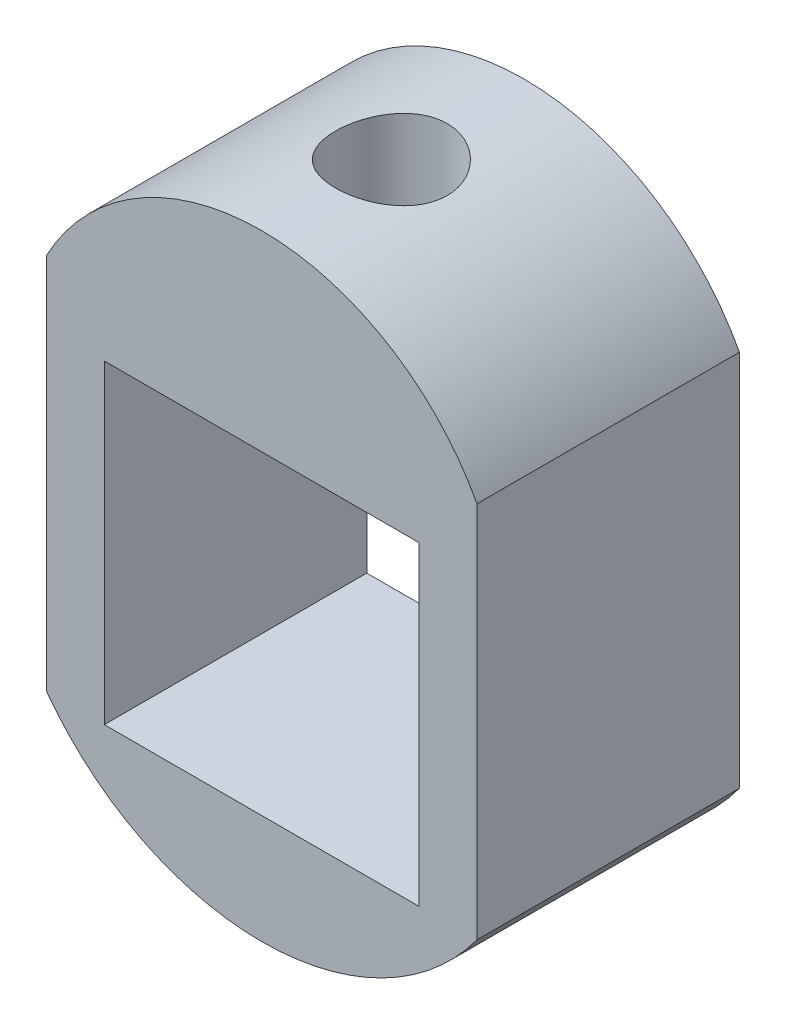
ISO-10303-21;
HEADER;
FILE_DESCRIPTION(('STEP AP214'),'2;1');
FILE_NAME('part.step','',(''),(''),'','','');
FILE_SCHEMA(('AUTOMOTIVE_DESIGN { 1 0 10303 214 1 1 1 1 }'));
ENDSEC;
DATA;
#1=APPLICATION_CONTEXT('core data for automotive mechanical design processes');
#2=APPLICATION_PROTOCOL_DEFINITION('international standard','automotive_design',2000,#1);
#3=PRODUCT_CONTEXT('',#1,'mechanical');
#4=PRODUCT('Part','Part','',(#3));
#5=PRODUCT_RELATED_PRODUCT_CATEGORY('part','',(#4));
#6=PRODUCT_DEFINITION_FORMATION('','',#4);
#7=PRODUCT_DEFINITION_CONTEXT('part definition',#1,'design');
#8=PRODUCT_DEFINITION('design','',#6,#7);
#9=PRODUCT_DEFINITION_SHAPE('','',#8);
#10=(LENGTH_UNIT() NAMED_UNIT(*) SI_UNIT(.MILLI.,.METRE.));
#11=(NAMED_UNIT(*) PLANE_ANGLE_UNIT() SI_UNIT($,.RADIAN.));
#12=(NAMED_UNIT(*) SI_UNIT($,.STERADIAN.) SOLID_ANGLE_UNIT());
#13=UNCERTAINTY_MEASURE_WITH_UNIT(LENGTH_MEASURE(1.E-05),#10,'distance_accuracy_value','');
#14=(GEOMETRIC_REPRESENTATION_CONTEXT(3) GLOBAL_UNCERTAINTY_ASSIGNED_CONTEXT((#13)) GLOBAL_UNIT_ASSIGNED_CONTEXT((#10,
#11,#12)) REPRESENTATION_CONTEXT('',''));
#15=CARTESIAN_POINT('',(0.,0.,0.));
#16=DIRECTION('',(0.,0.,1.));
#17=DIRECTION('',(1.,0.,0.));
#18=AXIS2_PLACEMENT_3D('',#15,#16,#17);
#19=CARTESIAN_POINT('',(-5.207,0.,6.35));
#20=DIRECTION('',(1.,0.,0.));
#21=DIRECTION('',(0.,0.,-1.));
#22=AXIS2_PLACEMENT_3D('',#19,#20,#21);
#23=PLANE('',#22);
#24=DIRECTION('',(0.,-1.,0.));
#25=VECTOR('',#24,1.);
#26=CARTESIAN_POINT('',(-5.207,0.,0.));
#27=LINE('',#26,#25);
#28=CARTESIAN_POINT('',(-5.207,2.78605119299707,0.));
#29=VERTEX_POINT('',#28);
#30=CARTESIAN_POINT('',(-5.207,-6.35,0.));
#31=VERTEX_POINT('',#30);
#32=EDGE_CURVE('E148',#29,#31,#27,.T.);
#33=ORIENTED_EDGE('',*,*,#32,.T.);
#34=DIRECTION('',(0.,0.,-1.));
#35=VECTOR('',#34,1.);
#36=CARTESIAN_POINT('',(-5.207,-6.35,6.35));
#37=LINE('',#36,#35);
#38=CARTESIAN_POINT('',(-5.207,-6.35,6.35));
#39=VERTEX_POINT('',#38);
#40=EDGE_CURVE('E127',#39,#31,#37,.T.);
#41=ORIENTED_EDGE('',*,*,#40,.F.);
#42=DIRECTION('',(0.,-1.,0.));
#43=VECTOR('',#42,1.);
#44=CARTESIAN_POINT('',(-5.207,0.,6.35));
#45=LINE('',#44,#43);
#46=CARTESIAN_POINT('',(-5.207,2.78605119299707,6.35));
#47=VERTEX_POINT('',#46);
#48=EDGE_CURVE('E116',#47,#39,#45,.T.);
#49=ORIENTED_EDGE('',*,*,#48,.F.);
#50=DIRECTION('',(0.,0.,-1.));
#51=VECTOR('',#50,1.);
#52=CARTESIAN_POINT('',(-5.207,2.78605119299707,6.35));
#53=LINE('',#52,#51);
#54=EDGE_CURVE('E55',#47,#29,#53,.T.);
#55=ORIENTED_EDGE('',*,*,#54,.T.);
#56=EDGE_LOOP('',(#33,#41,#49,#55));
#57=FACE_BOUND('',#56,.T.);
#58=ADVANCED_FACE('F34',(#57),#23,.F.);
#59=CARTESIAN_POINT('',(0.,-2.54,6.35));
#60=DIRECTION('',(0.,0.,-1.));
#61=DIRECTION('',(-1.,0.,0.));
#62=AXIS2_PLACEMENT_3D('',#59,#60,#61);
#63=CYLINDRICAL_SURFACE('',#62,6.45204998430731);
#64=CARTESIAN_POINT('',(1.35255,-8.84868904745669,3.175));
#65=CARTESIAN_POINT('',(1.35254731810095,-8.84869055847578,3.09992777123366));
#66=CARTESIAN_POINT('',(1.34627851866973,-8.85004364838439,3.02482255480596));
#67=CARTESIAN_POINT('',(1.32139313500362,-8.85530085935125,2.8767424233238));
#68=CARTESIAN_POINT('',(1.30276715161953,-8.85920692222398,2.80376917403624));
#69=CARTESIAN_POINT('',(1.25377504631357,-8.86910869684373,2.66211657545291));
#70=CARTESIAN_POINT('',(1.22342120677507,-8.87510222178223,2.59343282097094));
#71=CARTESIAN_POINT('',(1.15186944164405,-8.88850098616977,2.46213280625693));
#72=CARTESIAN_POINT('',(1.1106719278967,-8.89590617200065,2.39951631571237));
#73=CARTESIAN_POINT('',(1.01792048096284,-8.91142232275063,2.28115404702036));
#74=CARTESIAN_POINT('',(0.966230221653893,-8.91954168523675,2.22551618010988));
#75=CARTESIAN_POINT('',(0.854255004738417,-8.93549763141253,2.12363411274931));
#76=CARTESIAN_POINT('',(0.793969412797882,-8.94333419417808,2.07739060621264));
#77=CARTESIAN_POINT('',(0.66579569806459,-8.95793259488021,1.99518709225247));
#78=CARTESIAN_POINT('',(0.597840034780791,-8.9646833719222,1.95933026259963));
#79=CARTESIAN_POINT('',(0.456702939130856,-8.97625497327133,1.89958460707973));
#80=CARTESIAN_POINT('',(0.383522045599843,-8.98107599624044,1.87569454920836));
#81=CARTESIAN_POINT('',(0.235132843141455,-8.98818555581861,1.84089827239146));
#82=CARTESIAN_POINT('',(0.159969046284714,-8.99050964297623,1.82980961656334));
#83=CARTESIAN_POINT('',(0.00881449120110587,-8.99248644778009,1.82036110592088));
#84=CARTESIAN_POINT('',(-0.0671761789763218,-8.99213944712988,1.82199990881826));
#85=CARTESIAN_POINT('',(-0.216571729266554,-8.98884053094804,1.83782268118119));
#86=CARTESIAN_POINT('',(-0.289998462602698,-8.98592943508368,1.85181007265897));
#87=CARTESIAN_POINT('',(-0.433438831473196,-8.97787568927622,1.89162044013924));
#88=CARTESIAN_POINT('',(-0.503452321077305,-8.97273294401381,1.91744392169329));
#89=CARTESIAN_POINT('',(-0.638631957713402,-8.96072728187202,1.98037138395562));
#90=CARTESIAN_POINT('',(-0.703761778992071,-8.9538528696715,2.01755111610843));
#91=CARTESIAN_POINT('',(-0.826930238483115,-8.93913967502419,2.10207941718561));
#92=CARTESIAN_POINT('',(-0.884967983241743,-8.93130077132072,2.14942926526468));
#93=CARTESIAN_POINT('',(-0.993472738957296,-8.91534552825491,2.2540280367513));
#94=CARTESIAN_POINT('',(-1.0437736680983,-8.9072267502823,2.31144901333151));
#95=CARTESIAN_POINT('',(-1.1340611255008,-8.89176816342655,2.43399446794144));
#96=CARTESIAN_POINT('',(-1.1740474181972,-8.88442837233611,2.49911912185777));
#97=CARTESIAN_POINT('',(-1.24263607596657,-8.87135313917361,2.63547685852368));
#98=CARTESIAN_POINT('',(-1.27120929603508,-8.86562181551361,2.70672502248883));
#99=CARTESIAN_POINT('',(-1.31592882493586,-8.85647106327837,2.85315957228081));
#100=CARTESIAN_POINT('',(-1.3320769288861,-8.85305130074916,2.92834538753864));
#101=CARTESIAN_POINT('',(-1.35123490663019,-8.84897839292712,3.0790095276323));
#102=CARTESIAN_POINT('',(-1.35448561844921,-8.84827453934305,3.15445589235884));
#103=CARTESIAN_POINT('',(-1.34840661006562,-8.84957668900457,3.30481263520358));
#104=CARTESIAN_POINT('',(-1.33907767863095,-8.85158252234757,3.37972304663101));
#105=CARTESIAN_POINT('',(-1.30831250563892,-8.85803035107541,3.52605734283153));
#106=CARTESIAN_POINT('',(-1.28700693930963,-8.86244603800571,3.59750996596524));
#107=CARTESIAN_POINT('',(-1.23303389306623,-8.87319263451254,3.73583138544158));
#108=CARTESIAN_POINT('',(-1.20036539971863,-8.87952371491208,3.80269977228964));
#109=CARTESIAN_POINT('',(-1.12405602217766,-8.89350040050933,3.93100257282938));
#110=CARTESIAN_POINT('',(-1.08026561665732,-8.90116342932189,3.99234612118933));
#111=CARTESIAN_POINT('',(-0.983152919504988,-8.91689372023371,4.10690227594989));
#112=CARTESIAN_POINT('',(-0.929829545127975,-8.9249610281756,4.16011395746654));
#113=CARTESIAN_POINT('',(-0.814079008077935,-8.94075677338239,4.25781992931733));
#114=CARTESIAN_POINT('',(-0.751512523144307,-8.94847712105828,4.30215069157071));
#115=CARTESIAN_POINT('',(-0.619680408628287,-8.96256437782241,4.37967176177823));
#116=CARTESIAN_POINT('',(-0.55041507742037,-8.96893134715135,4.41286256562507));
#117=CARTESIAN_POINT('',(-0.407563671502095,-8.97956013267633,4.46692852360654));
#118=CARTESIAN_POINT('',(-0.334006653201187,-8.98383460145611,4.48787785053961));
#119=CARTESIAN_POINT('',(-0.184318383872938,-8.98985126247602,4.51709958183169));
#120=CARTESIAN_POINT('',(-0.108187476437772,-8.99159379135338,4.52537367145059));
#121=CARTESIAN_POINT('',(0.0429304126044655,-8.99234125050426,4.52893947867642));
#122=CARTESIAN_POINT('',(0.117911464345312,-8.99139784159502,4.52447618083733));
#123=CARTESIAN_POINT('',(0.266029556817464,-8.98698908439122,4.50323838615346));
#124=CARTESIAN_POINT('',(0.339166625574064,-8.98352377444905,4.48646407653119));
#125=CARTESIAN_POINT('',(0.481349391099032,-8.97446323743781,4.44119368048163));
#126=CARTESIAN_POINT('',(0.550405712396408,-8.96887385096616,4.41272972005578));
#127=CARTESIAN_POINT('',(0.68279618502563,-8.95616445503848,4.34492039788759));
#128=CARTESIAN_POINT('',(0.74612983030058,-8.9490443104051,4.30557407506363));
#129=CARTESIAN_POINT('',(0.866480363989624,-8.93389619757885,4.21630439187043));
#130=CARTESIAN_POINT('',(0.923366629582927,-8.92585447033046,4.16620724680415));
#131=CARTESIAN_POINT('',(1.02800902767336,-8.90984735464455,4.05721183459551));
#132=CARTESIAN_POINT('',(1.07576297735877,-8.90188198488912,3.99831146928066));
#133=CARTESIAN_POINT('',(1.16133630717202,-8.88682303151899,3.87252831454006));
#134=CARTESIAN_POINT('',(1.19902895147969,-8.87974111818079,3.80555783595069));
#135=CARTESIAN_POINT('',(1.26256535542218,-8.86739547592961,3.66610142285165));
#136=CARTESIAN_POINT('',(1.28841950332347,-8.86213015396412,3.59362038923312));
#137=CARTESIAN_POINT('',(1.32273073252715,-8.85502608194099,3.46334951486344));
#138=CARTESIAN_POINT('',(1.33389223608762,-8.85266494143895,3.40628503353234));
#139=CARTESIAN_POINT('',(1.34880275454635,-8.84949587164974,3.29115359018727));
#140=CARTESIAN_POINT('',(1.35255207510269,-8.84868787831508,3.23308666961075));
#141=CARTESIAN_POINT('',(1.35255,-8.84868904745669,3.175));
#142=B_SPLINE_CURVE_WITH_KNOTS('',3,(#64,#65,#66,#67,#68,#69,#70,#71,#72,#73,#74,#75,#76,#77,
#78,#79,#80,#81,#82,#83,#84,#85,#86,#87,#88,#89,#90,#91,#92,#93,#94,#95,#96,#97,#98,#99,#100,
#101,#102,#103,#104,#105,#106,#107,#108,#109,#110,#111,#112,#113,#114,#115,#116,#117,#118,#119,
#120,#121,#122,#123,#124,#125,#126,#127,#128,#129,#130,#131,#132,#133,#134,#135,#136,#137,#138,
#139,#140,#141),.UNSPECIFIED.,.T.,.F.,(4,2,2,2,2,2,2,2,2,2,2,2,2,2,2,2,2,2,2,2,2,2,2,2,2,2,2,2,
2,2,2,2,2,2,2,2,2,2,4),(0.,0.225003904809477,0.450179149112278,0.675119207658287,
0.900050724162645,1.12811688913009,1.35619989406017,1.58647646410806,1.81672932182344,
2.04365860838045,2.27056396239987,2.49392104419405,2.71728766706486,2.94217804994337,
3.16709673517585,3.39631844484094,3.62554538899492,3.8553540127441,4.08512942866738,
4.31059337859664,4.53604319215773,4.75907961299433,4.98213593104263,5.20836632590844,
5.43462243213843,5.66472390891371,5.89481514141521,6.123497362313,6.35214917569866,
6.5764330224374,6.80071345839927,7.02438159864208,7.24806949856658,7.47568984661094,
7.70336453279495,7.93378455274242,8.16400199008376,8.33810454022439,8.51219991070387),.UNSPECIFIED.);
#143=CARTESIAN_POINT('',(1.35255,-8.84868904745669,3.175));
#144=VERTEX_POINT('',#143);
#145=EDGE_CURVE('E11',#144,#144,#142,.T.);
#146=ORIENTED_EDGE('',*,*,#145,.T.);
#147=EDGE_LOOP('',(#146));
#148=FACE_BOUND('',#147,.T.);
#149=CARTESIAN_POINT('',(0.,-2.54,0.));
#150=DIRECTION('',(0.,0.,1.));
#151=DIRECTION('',(1.,0.,0.));
#152=AXIS2_PLACEMENT_3D('',#149,#150,#151);
#153=CIRCLE('',#152,6.45204998430731);
#154=CARTESIAN_POINT('',(5.207,-6.35,0.));
#155=VERTEX_POINT('',#154);
#156=EDGE_CURVE('E124',#31,#155,#153,.T.);
#157=ORIENTED_EDGE('',*,*,#156,.T.);
#158=DIRECTION('',(0.,0.,-1.));
#159=VECTOR('',#158,1.);
#160=CARTESIAN_POINT('',(5.207,-6.35,6.35));
#161=LINE('',#160,#159);
#162=CARTESIAN_POINT('',(5.207,-6.35,6.35));
#163=VERTEX_POINT('',#162);
#164=EDGE_CURVE('E122',#163,#155,#161,.T.);
#165=ORIENTED_EDGE('',*,*,#164,.F.);
#166=CARTESIAN_POINT('',(0.,-2.54,6.35));
#167=DIRECTION('',(0.,0.,1.));
#168=DIRECTION('',(1.,0.,0.));
#169=AXIS2_PLACEMENT_3D('',#166,#167,#168);
#170=CIRCLE('',#169,6.45204998430731);
#171=EDGE_CURVE('E110',#39,#163,#170,.T.);
#172=ORIENTED_EDGE('',*,*,#171,.F.);
#173=ORIENTED_EDGE('',*,*,#40,.T.);
#174=EDGE_LOOP('',(#157,#165,#172,#173));
#175=FACE_BOUND('',#174,.T.);
#176=ADVANCED_FACE('F123',(#148,#175),#63,.T.);
#177=CARTESIAN_POINT('',(5.207,0.,6.35));
#178=DIRECTION('',(1.,0.,0.));
#179=DIRECTION('',(0.,0.,-1.));
#180=AXIS2_PLACEMENT_3D('',#177,#178,#179);
#181=PLANE('',#180);
#182=DIRECTION('',(0.,-1.,0.));
#183=VECTOR('',#182,1.);
#184=CARTESIAN_POINT('',(5.207,0.,0.));
#185=LINE('',#184,#183);
#186=CARTESIAN_POINT('',(5.207,2.78605119299707,0.));
#187=VERTEX_POINT('',#186);
#188=EDGE_CURVE('E151',#187,#155,#185,.T.);
#189=ORIENTED_EDGE('',*,*,#188,.F.);
#190=DIRECTION('',(0.,0.,-1.));
#191=VECTOR('',#190,1.);
#192=CARTESIAN_POINT('',(5.207,2.78605119299707,6.35));
#193=LINE('',#192,#191);
#194=CARTESIAN_POINT('',(5.207,2.78605119299707,6.35));
#195=VERTEX_POINT('',#194);
#196=EDGE_CURVE('E81',#195,#187,#193,.T.);
#197=ORIENTED_EDGE('',*,*,#196,.F.);
#198=DIRECTION('',(0.,-1.,0.));
#199=VECTOR('',#198,1.);
#200=CARTESIAN_POINT('',(5.207,0.,6.35));
#201=LINE('',#200,#199);
#202=EDGE_CURVE('E115',#195,#163,#201,.T.);
#203=ORIENTED_EDGE('',*,*,#202,.T.);
#204=ORIENTED_EDGE('',*,*,#164,.T.);
#205=EDGE_LOOP('',(#189,#197,#203,#204));
#206=FACE_BOUND('',#205,.T.);
#207=ADVANCED_FACE('F129',(#206),#181,.T.);
#208=CARTESIAN_POINT('',(3.81,0.,6.35));
#209=DIRECTION('',(-1.,0.,0.));
#210=DIRECTION('',(0.,-1.,0.));
#211=AXIS2_PLACEMENT_3D('',#208,#209,#210);
#212=PLANE('',#211);
#213=DIRECTION('',(0.,1.,0.));
#214=VECTOR('',#213,1.);
#215=CARTESIAN_POINT('',(3.81,0.,0.));
#216=LINE('',#215,#214);
#217=CARTESIAN_POINT('',(3.81,-6.35,0.));
#218=VERTEX_POINT('',#217);
#219=CARTESIAN_POINT('',(3.81,1.27,0.));
#220=VERTEX_POINT('',#219);
#221=EDGE_CURVE('E136',#218,#220,#216,.T.);
#222=ORIENTED_EDGE('',*,*,#221,.F.);
#223=DIRECTION('',(0.,0.,-1.));
#224=VECTOR('',#223,1.);
#225=CARTESIAN_POINT('',(3.81,-6.35,6.35));
#226=LINE('',#225,#224);
#227=CARTESIAN_POINT('',(3.81,-6.35,6.35));
#228=VERTEX_POINT('',#227);
#229=EDGE_CURVE('E93',#228,#218,#226,.T.);
#230=ORIENTED_EDGE('',*,*,#229,.F.);
#231=DIRECTION('',(0.,1.,0.));
#232=VECTOR('',#231,1.);
#233=CARTESIAN_POINT('',(3.81,0.,6.35));
#234=LINE('',#233,#232);
#235=CARTESIAN_POINT('',(3.81,1.27,6.35));
#236=VERTEX_POINT('',#235);
#237=EDGE_CURVE('E156',#228,#236,#234,.T.);
#238=ORIENTED_EDGE('',*,*,#237,.T.);
#239=DIRECTION('',(0.,0.,-1.));
#240=VECTOR('',#239,1.);
#241=CARTESIAN_POINT('',(3.81,1.27,6.35));
#242=LINE('',#241,#240);
#243=EDGE_CURVE('E132',#236,#220,#242,.T.);
#244=ORIENTED_EDGE('',*,*,#243,.T.);
#245=EDGE_LOOP('',(#222,#230,#238,#244));
#246=FACE_BOUND('',#245,.T.);
#247=ADVANCED_FACE('F36',(#246),#212,.T.);
#248=CARTESIAN_POINT('',(0.,-6.35,6.35));
#249=DIRECTION('',(0.,1.,0.));
#250=DIRECTION('',(-1.,0.,0.));
#251=AXIS2_PLACEMENT_3D('',#248,#249,#250);
#252=PLANE('',#251);
#253=DIRECTION('',(1.,0.,0.));
#254=VECTOR('',#253,1.);
#255=CARTESIAN_POINT('',(0.,-6.35,0.));
#256=LINE('',#255,#254);
#257=CARTESIAN_POINT('',(-3.81,-6.35,0.));
#258=VERTEX_POINT('',#257);
#259=EDGE_CURVE('E139',#258,#218,#256,.T.);
#260=ORIENTED_EDGE('',*,*,#259,.F.);
#261=DIRECTION('',(0.,0.,-1.));
#262=VECTOR('',#261,1.);
#263=CARTESIAN_POINT('',(-3.81,-6.35,6.35));
#264=LINE('',#263,#262);
#265=CARTESIAN_POINT('',(-3.81,-6.35,6.35));
#266=VERTEX_POINT('',#265);
#267=EDGE_CURVE('E164',#266,#258,#264,.T.);
#268=ORIENTED_EDGE('',*,*,#267,.F.);
#269=DIRECTION('',(1.,0.,0.));
#270=VECTOR('',#269,1.);
#271=CARTESIAN_POINT('',(0.,-6.35,6.35));
#272=LINE('',#271,#270);
#273=EDGE_CURVE('E223',#266,#228,#272,.T.);
#274=ORIENTED_EDGE('',*,*,#273,.T.);
#275=ORIENTED_EDGE('',*,*,#229,.T.);
#276=EDGE_LOOP('',(#260,#268,#274,#275));
#277=FACE_BOUND('',#276,.T.);
#278=ADVANCED_FACE('F205',(#277),#252,.T.);
#279=CARTESIAN_POINT('',(-3.81,0.,6.35));
#280=DIRECTION('',(-1.,0.,0.));
#281=DIRECTION('',(0.,-1.,0.));
#282=AXIS2_PLACEMENT_3D('',#279,#280,#281);
#283=PLANE('',#282);
#284=DIRECTION('',(0.,1.,0.));
#285=VECTOR('',#284,1.);
#286=CARTESIAN_POINT('',(-3.81,0.,0.));
#287=LINE('',#286,#285);
#288=CARTESIAN_POINT('',(-3.81,1.27,0.));
#289=VERTEX_POINT('',#288);
#290=EDGE_CURVE('E143',#258,#289,#287,.T.);
#291=ORIENTED_EDGE('',*,*,#290,.T.);
#292=DIRECTION('',(0.,0.,-1.));
#293=VECTOR('',#292,1.);
#294=CARTESIAN_POINT('',(-3.81,1.27,6.35));
#295=LINE('',#294,#293);
#296=CARTESIAN_POINT('',(-3.81,1.27,6.35));
#297=VERTEX_POINT('',#296);
#298=EDGE_CURVE('E161',#297,#289,#295,.T.);
#299=ORIENTED_EDGE('',*,*,#298,.F.);
#300=DIRECTION('',(0.,1.,0.));
#301=VECTOR('',#300,1.);
#302=CARTESIAN_POINT('',(-3.81,0.,6.35));
#303=LINE('',#302,#301);
#304=EDGE_CURVE('E221',#266,#297,#303,.T.);
#305=ORIENTED_EDGE('',*,*,#304,.F.);
#306=ORIENTED_EDGE('',*,*,#267,.T.);
#307=EDGE_LOOP('',(#291,#299,#305,#306));
#308=FACE_BOUND('',#307,.T.);
#309=ADVANCED_FACE('F202',(#308),#283,.F.);
#310=CARTESIAN_POINT('',(0.,1.27,6.35));
#311=DIRECTION('',(0.,1.,0.));
#312=DIRECTION('',(-1.,0.,0.));
#313=AXIS2_PLACEMENT_3D('',#310,#311,#312);
#314=PLANE('',#313);
#315=DIRECTION('',(1.,0.,0.));
#316=VECTOR('',#315,1.);
#317=CARTESIAN_POINT('',(0.,1.27,0.));
#318=LINE('',#317,#316);
#319=EDGE_CURVE('E145',#289,#220,#318,.T.);
#320=ORIENTED_EDGE('',*,*,#319,.T.);
#321=ORIENTED_EDGE('',*,*,#243,.F.);
#322=DIRECTION('',(1.,0.,0.));
#323=VECTOR('',#322,1.);
#324=CARTESIAN_POINT('',(0.,1.27,6.35));
#325=LINE('',#324,#323);
#326=EDGE_CURVE('E220',#297,#236,#325,.T.);
#327=ORIENTED_EDGE('',*,*,#326,.F.);
#328=ORIENTED_EDGE('',*,*,#298,.T.);
#329=EDGE_LOOP('',(#320,#321,#327,#328));
#330=FACE_BOUND('',#329,.T.);
#331=ADVANCED_FACE('F199',(#330),#314,.F.);
#332=CARTESIAN_POINT('',(0.,0.,6.35));
#333=DIRECTION('',(0.,0.,-1.));
#334=DIRECTION('',(-1.,0.,0.));
#335=AXIS2_PLACEMENT_3D('',#332,#333,#334);
#336=CYLINDRICAL_SURFACE('',#335,5.90550000000003);
#337=CARTESIAN_POINT('',(-1.35255,5.7485249192728,3.21434654674846));
#338=CARTESIAN_POINT('',(-1.35254755253758,5.74852642502517,3.2892429151539));
#339=CARTESIAN_POINT('',(-1.3463078397767,5.75000459050904,3.36416792548015));
#340=CARTESIAN_POINT('',(-1.32154506049321,5.75574535873707,3.51188064325613));
#341=CARTESIAN_POINT('',(-1.30301366473321,5.76000984955508,3.58466686644456));
#342=CARTESIAN_POINT('',(-1.25428706518104,5.77081553233588,3.72594402095015));
#343=CARTESIAN_POINT('',(-1.22410536736108,5.77735408715409,3.79443981959848));
#344=CARTESIAN_POINT('',(-1.15297441539319,5.79196796330515,3.92539916667142));
#345=CARTESIAN_POINT('',(-1.11202516507732,5.80004328409108,3.98786271724283));
#346=CARTESIAN_POINT('',(-1.01971335521515,5.81698784635845,4.10614068045814));
#347=CARTESIAN_POINT('',(-0.968188857861686,5.82586806263614,4.16182715713219));
#348=CARTESIAN_POINT('',(-0.856538499333979,5.84332604290488,4.26384767939593));
#349=CARTESIAN_POINT('',(-0.796411929415556,5.85190378190148,4.31018095359499));
#350=CARTESIAN_POINT('',(-0.66840045995198,5.86791046847881,4.39269142293514));
#351=CARTESIAN_POINT('',(-0.600433742356766,5.87532495448108,4.4287447281377));
#352=CARTESIAN_POINT('',(-0.459207606952314,5.88804536247796,4.48886905941756));
#353=CARTESIAN_POINT('',(-0.385948842787869,5.89335154435436,4.51294156241039));
#354=CARTESIAN_POINT('',(-0.237549612543536,5.90117991696792,4.5480162255732));
#355=CARTESIAN_POINT('',(-0.162462855472565,5.90374822778011,4.55923515736171));
#356=CARTESIAN_POINT('',(-0.0114320187253266,5.90597156455726,4.56896281353298));
#357=CARTESIAN_POINT('',(0.0645119526313096,5.90562695457978,4.56747312624188));
#358=CARTESIAN_POINT('',(0.213604238843734,5.90209823701594,4.55198553276876));
#359=CARTESIAN_POINT('',(0.28677827780131,5.89896719584083,4.53822137860638));
#360=CARTESIAN_POINT('',(0.429749373412345,5.89027829002513,4.49894907441225));
#361=CARTESIAN_POINT('',(0.499546267901052,5.88472030897519,4.47344036104392));
#362=CARTESIAN_POINT('',(0.634420214832536,5.87171798555809,4.4112019130082));
#363=CARTESIAN_POINT('',(0.699455717935901,5.86425911667869,4.37438529790964));
#364=CARTESIAN_POINT('',(0.822509686794591,5.84827017078372,4.2906412495527));
#365=CARTESIAN_POINT('',(0.880527109370497,5.83973993490148,4.24371231605852));
#366=CARTESIAN_POINT('',(0.989289688083592,5.8223142543553,4.13980915572344));
#367=CARTESIAN_POINT('',(1.03983901924285,5.81341491694922,4.08263040531336));
#368=CARTESIAN_POINT('',(1.13067029351419,5.7964347946514,3.96051471077108));
#369=CARTESIAN_POINT('',(1.17095190117197,5.78835403650846,3.89557751326629));
#370=CARTESIAN_POINT('',(1.24020313178487,5.77391444616205,3.75945055866513));
#371=CARTESIAN_POINT('',(1.26913258137072,5.76756175318366,3.68823966910145));
#372=CARTESIAN_POINT('',(1.31455305486277,5.75738030944454,3.54178640384722));
#373=CARTESIAN_POINT('',(1.33104626437017,5.75355111520761,3.466544739034));
#374=CARTESIAN_POINT('',(1.35081572196531,5.74894154045024,3.31596356529733));
#375=CARTESIAN_POINT('',(1.35437849340895,5.74809507859592,3.24066365163473));
#376=CARTESIAN_POINT('',(1.34896442569326,5.74936803655771,3.09054574136546));
#377=CARTESIAN_POINT('',(1.33998853842795,5.75148723123087,3.01572770860914));
#378=CARTESIAN_POINT('',(1.31000141016514,5.75839002414701,2.86971569729029));
#379=CARTESIAN_POINT('',(1.28915079387624,5.76313803999333,2.79848689144955));
#380=CARTESIAN_POINT('',(1.2361812993855,5.7747308630903,2.66053418066821));
#381=CARTESIAN_POINT('',(1.20406125857834,5.78157588666861,2.59381074136903));
#382=CARTESIAN_POINT('',(1.12884346939902,5.79673473073584,2.46553101941873));
#383=CARTESIAN_POINT('',(1.08557085572991,5.80507123316293,2.40408000701613));
#384=CARTESIAN_POINT('',(0.989502615561245,5.82221525547694,2.28920647731512));
#385=CARTESIAN_POINT('',(0.936705686457633,5.83102283967584,2.23578506002795));
#386=CARTESIAN_POINT('',(0.821785063816795,5.84833640713794,2.13735977986387));
#387=CARTESIAN_POINT('',(0.759491513467017,5.85683242771775,2.09255218213631));
#388=CARTESIAN_POINT('',(0.628095817423184,5.87237566154498,2.01403682039878));
#389=CARTESIAN_POINT('',(0.558994004878278,5.8794229456315,1.98032851361659));
#390=CARTESIAN_POINT('',(0.416392965977667,5.89123300711111,1.92523427222648));
#391=CARTESIAN_POINT('',(0.342926751212368,5.89601095797001,1.90376629557912));
#392=CARTESIAN_POINT('',(0.193307788881995,5.90280989499429,1.87350858709534));
#393=CARTESIAN_POINT('',(0.117155473743602,5.90483132286413,1.86471682401308));
#394=CARTESIAN_POINT('',(-0.0338171861527842,5.90587477988602,1.86015976118673));
#395=CARTESIAN_POINT('',(-0.10862840168037,5.90496402363632,1.86410255332112));
#396=CARTESIAN_POINT('',(-0.256491751788338,5.90039104403118,1.88424480062248));
#397=CARTESIAN_POINT('',(-0.329543924078109,5.8967288797132,1.90044399280177));
#398=CARTESIAN_POINT('',(-0.471564320974082,5.88707129753994,1.94449375968619));
#399=CARTESIAN_POINT('',(-0.540547169564884,5.88108490599789,1.97229929128772));
#400=CARTESIAN_POINT('',(-0.672905335027142,5.86741516940092,2.03872984097792));
#401=CARTESIAN_POINT('',(-0.736280051729318,5.85973164302942,2.07735601522851));
#402=CARTESIAN_POINT('',(-0.857034736684137,5.84330517297804,2.16526381518571));
#403=CARTESIAN_POINT('',(-0.914264358730588,5.83454366927609,2.21474851038703));
#404=CARTESIAN_POINT('',(-1.01970689012116,5.81704318453911,2.32256381260867));
#405=CARTESIAN_POINT('',(-1.06791759267159,5.80830420953103,2.38089657831236));
#406=CARTESIAN_POINT('',(-1.15465407962349,5.7916913402144,2.50580350040717));
#407=CARTESIAN_POINT('',(-1.19302399729225,5.78383236262008,2.57248800435486));
#408=CARTESIAN_POINT('',(-1.257951033138,5.77006059271307,2.71152722043434));
#409=CARTESIAN_POINT('',(-1.28451771606786,5.76414622559913,2.78387728534375));
#410=CARTESIAN_POINT('',(-1.32058602010433,5.75597438330428,2.91592638815698));
#411=CARTESIAN_POINT('',(-1.33254857215427,5.75320013076113,2.9749335435841));
#412=CARTESIAN_POINT('',(-1.34853131158451,5.74947484767584,3.09406986829308));
#413=CARTESIAN_POINT('',(-1.35255196550157,5.74852371003722,3.15419897145806));
#414=CARTESIAN_POINT('',(-1.35255,5.7485249192728,3.21434654674846));
#415=B_SPLINE_CURVE_WITH_KNOTS('',3,(#337,#338,#339,#340,#341,#342,#343,#344,#345,#346,#347,
#348,#349,#350,#351,#352,#353,#354,#355,#356,#357,#358,#359,#360,#361,#362,#363,#364,#365,#366,
#367,#368,#369,#370,#371,#372,#373,#374,#375,#376,#377,#378,#379,#380,#381,#382,#383,#384,#385,
#386,#387,#388,#389,#390,#391,#392,#393,#394,#395,#396,#397,#398,#399,#400,#401,#402,#403,#404,
#405,#406,#407,#408,#409,#410,#411,#412,#413,#414),.UNSPECIFIED.,.T.,.F.,(4,2,2,2,2,2,2,2,2,2,2,
2,2,2,2,2,2,2,2,2,2,2,2,2,2,2,2,2,2,2,2,2,2,2,2,2,2,2,4),(0.,0.224468535810266,
0.449089334285811,0.673450512449134,0.897811610765025,1.12590604709458,1.3540192874743,
1.58477548931944,1.81550323798766,2.04227974314833,2.26902790614455,2.49154801739183,
2.71407880309508,2.93836401032293,3.16268251482574,3.39211225854032,3.6215494969383,
3.85179150655859,4.08199304296737,4.30706132443099,4.53211252037425,4.75418948149683,
4.97628935983328,5.2021094195249,5.42796038720647,5.65846800256529,5.88896434407627,
6.11789702924744,6.34679302599734,6.57047971054784,6.79416159555111,7.01698334680581,
7.23982891516255,7.46726408435339,7.69475483092197,7.92565273799203,8.15636319410922,
8.33663937610266,8.51690496768495),.UNSPECIFIED.);
#416=CARTESIAN_POINT('',(-1.35255,5.7485249192728,3.21434654674846));
#417=VERTEX_POINT('',#416);
#418=EDGE_CURVE('E47',#417,#417,#415,.T.);
#419=ORIENTED_EDGE('',*,*,#418,.F.);
#420=EDGE_LOOP('',(#419));
#421=FACE_BOUND('',#420,.T.);
#422=CARTESIAN_POINT('',(0.,0.,0.));
#423=DIRECTION('',(0.,0.,1.));
#424=DIRECTION('',(1.,0.,0.));
#425=AXIS2_PLACEMENT_3D('',#422,#423,#424);
#426=CIRCLE('',#425,5.90550000000003);
#427=EDGE_CURVE('E153',#29,#187,#426,.F.);
#428=ORIENTED_EDGE('',*,*,#427,.F.);
#429=ORIENTED_EDGE('',*,*,#54,.F.);
#430=CARTESIAN_POINT('',(0.,0.,6.35));
#431=DIRECTION('',(0.,0.,1.));
#432=DIRECTION('',(1.,0.,0.));
#433=AXIS2_PLACEMENT_3D('',#430,#431,#432);
#434=CIRCLE('',#433,5.90550000000003);
#435=EDGE_CURVE('E130',#47,#195,#434,.F.);
#436=ORIENTED_EDGE('',*,*,#435,.T.);
#437=ORIENTED_EDGE('',*,*,#196,.T.);
#438=EDGE_LOOP('',(#428,#429,#436,#437));
#439=FACE_BOUND('',#438,.T.);
#440=ADVANCED_FACE('F171',(#421,#439),#336,.T.);
#441=CARTESIAN_POINT('',(0.,0.,6.35));
#442=DIRECTION('',(0.,0.,1.));
#443=DIRECTION('',(1.,0.,0.));
#444=AXIS2_PLACEMENT_3D('',#441,#442,#443);
#445=PLANE('',#444);
#446=ORIENTED_EDGE('',*,*,#237,.F.);
#447=ORIENTED_EDGE('',*,*,#273,.F.);
#448=ORIENTED_EDGE('',*,*,#304,.T.);
#449=ORIENTED_EDGE('',*,*,#326,.T.);
#450=EDGE_LOOP('',(#446,#447,#448,#449));
#451=FACE_BOUND('',#450,.T.);
#452=ORIENTED_EDGE('',*,*,#48,.T.);
#453=ORIENTED_EDGE('',*,*,#171,.T.);
#454=ORIENTED_EDGE('',*,*,#202,.F.);
#455=ORIENTED_EDGE('',*,*,#435,.F.);
#456=EDGE_LOOP('',(#452,#453,#454,#455));
#457=FACE_BOUND('',#456,.T.);
#458=ADVANCED_FACE('F112',(#451,#457),#445,.T.);
#459=CARTESIAN_POINT('',(0.,0.,0.));
#460=DIRECTION('',(0.,0.,1.));
#461=DIRECTION('',(1.,0.,0.));
#462=AXIS2_PLACEMENT_3D('',#459,#460,#461);
#463=PLANE('',#462);
#464=ORIENTED_EDGE('',*,*,#221,.T.);
#465=ORIENTED_EDGE('',*,*,#319,.F.);
#466=ORIENTED_EDGE('',*,*,#290,.F.);
#467=ORIENTED_EDGE('',*,*,#259,.T.);
#468=EDGE_LOOP('',(#464,#465,#466,#467));
#469=FACE_BOUND('',#468,.T.);
#470=ORIENTED_EDGE('',*,*,#32,.F.);
#471=ORIENTED_EDGE('',*,*,#427,.T.);
#472=ORIENTED_EDGE('',*,*,#188,.T.);
#473=ORIENTED_EDGE('',*,*,#156,.F.);
#474=EDGE_LOOP('',(#470,#471,#472,#473));
#475=FACE_BOUND('',#474,.T.);
#476=ADVANCED_FACE('F181',(#469,#475),#463,.F.);
#477=CARTESIAN_POINT('',(0.,2.09550000000003,3.21434654674846));
#478=DIRECTION('',(0.,1.,0.));
#479=DIRECTION('',(-1.,0.,0.));
#480=AXIS2_PLACEMENT_3D('',#477,#478,#479);
#481=CYLINDRICAL_SURFACE('',#480,1.35255);
#482=ORIENTED_EDGE('',*,*,#418,.T.);
#483=EDGE_LOOP('',(#482));
#484=FACE_BOUND('',#483,.T.);
#485=CARTESIAN_POINT('',(0.,2.09550000000003,3.21434654674846));
#486=DIRECTION('',(0.,1.,0.));
#487=DIRECTION('',(-1.,0.,0.));
#488=AXIS2_PLACEMENT_3D('',#485,#486,#487);
#489=CIRCLE('',#488,1.35255);
#490=CARTESIAN_POINT('',(-1.35255,2.09550000000003,3.21434654674846));
#491=VERTEX_POINT('',#490);
#492=EDGE_CURVE('E140',#491,#491,#489,.T.);
#493=ORIENTED_EDGE('',*,*,#492,.F.);
#494=EDGE_LOOP('',(#493));
#495=FACE_BOUND('',#494,.T.);
#496=ADVANCED_FACE('F175',(#484,#495),#481,.F.);
#497=CARTESIAN_POINT('',(0.,2.09550000000003,3.21434654674846));
#498=DIRECTION('',(0.,1.,0.));
#499=DIRECTION('',(-1.,0.,0.));
#500=AXIS2_PLACEMENT_3D('',#497,#498,#499);
#501=PLANE('',#500);
#502=ORIENTED_EDGE('',*,*,#492,.T.);
#503=EDGE_LOOP('',(#502));
#504=FACE_BOUND('',#503,.T.);
#505=ADVANCED_FACE('F180',(#504),#501,.T.);
#506=CARTESIAN_POINT('',(0.,-6.45204998430731,3.175));
#507=DIRECTION('',(0.,-1.,0.));
#508=DIRECTION('',(1.,0.,0.));
#509=AXIS2_PLACEMENT_3D('',#506,#507,#508);
#510=CYLINDRICAL_SURFACE('',#509,1.35255);
#511=CARTESIAN_POINT('',(0.,-6.45204998430731,3.175));
#512=DIRECTION('',(0.,-1.,0.));
#513=DIRECTION('',(1.,0.,0.));
#514=AXIS2_PLACEMENT_3D('',#511,#512,#513);
#515=CIRCLE('',#514,1.35255);
#516=CARTESIAN_POINT('',(1.35255,-6.45204998430731,3.175));
#517=VERTEX_POINT('',#516);
#518=EDGE_CURVE('E230',#517,#517,#515,.T.);
#519=ORIENTED_EDGE('',*,*,#518,.F.);
#520=EDGE_LOOP('',(#519));
#521=FACE_BOUND('',#520,.T.);
#522=ORIENTED_EDGE('',*,*,#145,.F.);
#523=EDGE_LOOP('',(#522));
#524=FACE_BOUND('',#523,.T.);
#525=ADVANCED_FACE('F236',(#521,#524),#510,.F.);
#526=CARTESIAN_POINT('',(0.,-6.45204998430731,3.175));
#527=DIRECTION('',(0.,-1.,0.));
#528=DIRECTION('',(1.,0.,0.));
#529=AXIS2_PLACEMENT_3D('',#526,#527,#528);
#530=PLANE('',#529);
#531=ORIENTED_EDGE('',*,*,#518,.T.);
#532=EDGE_LOOP('',(#531));
#533=FACE_BOUND('',#532,.T.);
#534=ADVANCED_FACE('F234',(#533),#530,.T.);
#535=CLOSED_SHELL('',(#58,#176,#207,#247,#278,#309,#331,#440,#458,#476,#496,#505,#525,#534));
#536=MANIFOLD_SOLID_BREP('B2',#535);
#537=ADVANCED_BREP_SHAPE_REPRESENTATION('',(#18,#536),#14);
#538=SHAPE_DEFINITION_REPRESENTATION(#9,#537);
ENDSEC;
END-ISO-10303-21;
